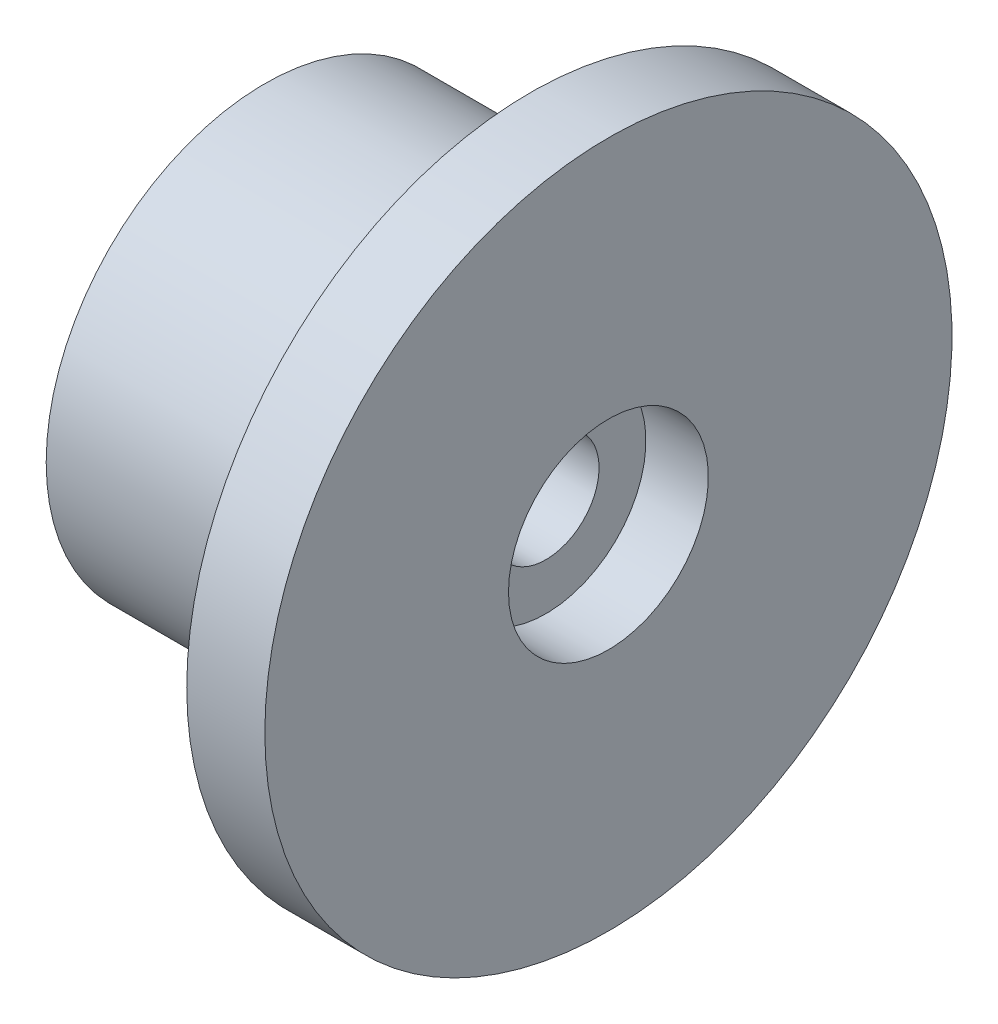
ISO-10303-21;
HEADER;
FILE_DESCRIPTION(('STEP AP214'),'2;1');
FILE_NAME('part.step','',(''),(''),'','','');
FILE_SCHEMA(('AUTOMOTIVE_DESIGN { 1 0 10303 214 1 1 1 1 }'));
ENDSEC;
DATA;
#1=APPLICATION_CONTEXT('core data for automotive mechanical design processes');
#2=APPLICATION_PROTOCOL_DEFINITION('international standard','automotive_design',2000,#1);
#3=PRODUCT_CONTEXT('',#1,'mechanical');
#4=PRODUCT('Part','Part','',(#3));
#5=PRODUCT_RELATED_PRODUCT_CATEGORY('part','',(#4));
#6=PRODUCT_DEFINITION_FORMATION('','',#4);
#7=PRODUCT_DEFINITION_CONTEXT('part definition',#1,'design');
#8=PRODUCT_DEFINITION('design','',#6,#7);
#9=PRODUCT_DEFINITION_SHAPE('','',#8);
#10=(LENGTH_UNIT() NAMED_UNIT(*) SI_UNIT(.MILLI.,.METRE.));
#11=(NAMED_UNIT(*) PLANE_ANGLE_UNIT() SI_UNIT($,.RADIAN.));
#12=(NAMED_UNIT(*) SI_UNIT($,.STERADIAN.) SOLID_ANGLE_UNIT());
#13=UNCERTAINTY_MEASURE_WITH_UNIT(LENGTH_MEASURE(1.E-05),#10,'distance_accuracy_value','');
#14=(GEOMETRIC_REPRESENTATION_CONTEXT(3) GLOBAL_UNCERTAINTY_ASSIGNED_CONTEXT((#13)) GLOBAL_UNIT_ASSIGNED_CONTEXT((#10,
#11,#12)) REPRESENTATION_CONTEXT('',''));
#15=CARTESIAN_POINT('',(0.,0.,0.));
#16=DIRECTION('',(0.,0.,1.));
#17=DIRECTION('',(1.,0.,0.));
#18=AXIS2_PLACEMENT_3D('',#15,#16,#17);
#19=CARTESIAN_POINT('',(-5.,0.,0.));
#20=DIRECTION('',(-1.,0.,0.));
#21=DIRECTION('',(0.,0.,1.));
#22=AXIS2_PLACEMENT_3D('',#19,#20,#21);
#23=CYLINDRICAL_SURFACE('',#22,1.7);
#24=CARTESIAN_POINT('',(8.99999999999999,0.,0.));
#25=DIRECTION('',(-1.,0.,0.));
#26=DIRECTION('',(0.,0.,1.));
#27=AXIS2_PLACEMENT_3D('',#24,#25,#26);
#28=CIRCLE('',#27,1.7);
#29=CARTESIAN_POINT('',(8.99999999999999,0.,1.7));
#30=VERTEX_POINT('',#29);
#31=EDGE_CURVE('E65',#30,#30,#28,.T.);
#32=ORIENTED_EDGE('',*,*,#31,.F.);
#33=EDGE_LOOP('',(#32));
#34=FACE_BOUND('',#33,.T.);
#35=CARTESIAN_POINT('',(0.,0.,0.));
#36=DIRECTION('',(-1.,0.,0.));
#37=DIRECTION('',(0.,0.,1.));
#38=AXIS2_PLACEMENT_3D('',#35,#36,#37);
#39=CIRCLE('',#38,1.7);
#40=CARTESIAN_POINT('',(0.,0.,1.7));
#41=VERTEX_POINT('',#40);
#42=EDGE_CURVE('E10',#41,#41,#39,.T.);
#43=ORIENTED_EDGE('',*,*,#42,.T.);
#44=EDGE_LOOP('',(#43));
#45=FACE_BOUND('',#44,.T.);
#46=ADVANCED_FACE('F40',(#34,#45),#23,.F.);
#47=CARTESIAN_POINT('',(0.,1.7,0.));
#48=DIRECTION('',(1.,0.,0.));
#49=DIRECTION('',(0.,0.,-1.));
#50=AXIS2_PLACEMENT_3D('',#47,#48,#49);
#51=PLANE('',#50);
#52=ORIENTED_EDGE('',*,*,#42,.F.);
#53=EDGE_LOOP('',(#52));
#54=FACE_BOUND('',#53,.T.);
#55=CARTESIAN_POINT('',(0.,0.,0.));
#56=DIRECTION('',(-1.,0.,0.));
#57=DIRECTION('',(0.,0.,1.));
#58=AXIS2_PLACEMENT_3D('',#55,#56,#57);
#59=CIRCLE('',#58,7.);
#60=CARTESIAN_POINT('',(0.,0.,7.));
#61=VERTEX_POINT('',#60);
#62=EDGE_CURVE('E43',#61,#61,#59,.T.);
#63=ORIENTED_EDGE('',*,*,#62,.T.);
#64=EDGE_LOOP('',(#63));
#65=FACE_BOUND('',#64,.T.);
#66=ADVANCED_FACE('F72',(#54,#65),#51,.F.);
#67=CARTESIAN_POINT('',(-5.,0.,0.));
#68=DIRECTION('',(-1.,0.,0.));
#69=DIRECTION('',(0.,0.,1.));
#70=AXIS2_PLACEMENT_3D('',#67,#68,#69);
#71=CYLINDRICAL_SURFACE('',#70,7.);
#72=ORIENTED_EDGE('',*,*,#62,.F.);
#73=EDGE_LOOP('',(#72));
#74=FACE_BOUND('',#73,.T.);
#75=CARTESIAN_POINT('',(8.5,0.,0.));
#76=DIRECTION('',(-1.,0.,0.));
#77=DIRECTION('',(0.,0.,1.));
#78=AXIS2_PLACEMENT_3D('',#75,#76,#77);
#79=CIRCLE('',#78,7.);
#80=CARTESIAN_POINT('',(8.5,0.,7.));
#81=VERTEX_POINT('',#80);
#82=EDGE_CURVE('E50',#81,#81,#79,.T.);
#83=ORIENTED_EDGE('',*,*,#82,.T.);
#84=EDGE_LOOP('',(#83));
#85=FACE_BOUND('',#84,.T.);
#86=ADVANCED_FACE('F78',(#74,#85),#71,.T.);
#87=CARTESIAN_POINT('',(8.5,7.,0.));
#88=DIRECTION('',(1.,0.,0.));
#89=DIRECTION('',(0.,0.,-1.));
#90=AXIS2_PLACEMENT_3D('',#87,#88,#89);
#91=PLANE('',#90);
#92=ORIENTED_EDGE('',*,*,#82,.F.);
#93=EDGE_LOOP('',(#92));
#94=FACE_BOUND('',#93,.T.);
#95=CARTESIAN_POINT('',(8.5,0.,0.));
#96=DIRECTION('',(-1.,0.,0.));
#97=DIRECTION('',(0.,0.,1.));
#98=AXIS2_PLACEMENT_3D('',#95,#96,#97);
#99=CIRCLE('',#98,11.);
#100=CARTESIAN_POINT('',(8.5,0.,11.));
#101=VERTEX_POINT('',#100);
#102=EDGE_CURVE('E51',#101,#101,#99,.T.);
#103=ORIENTED_EDGE('',*,*,#102,.T.);
#104=EDGE_LOOP('',(#103));
#105=FACE_BOUND('',#104,.T.);
#106=ADVANCED_FACE('F83',(#94,#105),#91,.F.);
#107=CARTESIAN_POINT('',(-5.,0.,0.));
#108=DIRECTION('',(-1.,0.,0.));
#109=DIRECTION('',(0.,0.,1.));
#110=AXIS2_PLACEMENT_3D('',#107,#108,#109);
#111=CYLINDRICAL_SURFACE('',#110,11.);
#112=ORIENTED_EDGE('',*,*,#102,.F.);
#113=EDGE_LOOP('',(#112));
#114=FACE_BOUND('',#113,.T.);
#115=CARTESIAN_POINT('',(11.,0.,0.));
#116=DIRECTION('',(-1.,0.,0.));
#117=DIRECTION('',(0.,0.,1.));
#118=AXIS2_PLACEMENT_3D('',#115,#116,#117);
#119=CIRCLE('',#118,11.);
#120=CARTESIAN_POINT('',(11.,0.,11.));
#121=VERTEX_POINT('',#120);
#122=EDGE_CURVE('E57',#121,#121,#119,.T.);
#123=ORIENTED_EDGE('',*,*,#122,.T.);
#124=EDGE_LOOP('',(#123));
#125=FACE_BOUND('',#124,.T.);
#126=ADVANCED_FACE('F90',(#114,#125),#111,.T.);
#127=CARTESIAN_POINT('',(11.,11.,0.));
#128=DIRECTION('',(-1.,0.,0.));
#129=DIRECTION('',(0.,0.,1.));
#130=AXIS2_PLACEMENT_3D('',#127,#128,#129);
#131=PLANE('',#130);
#132=ORIENTED_EDGE('',*,*,#122,.F.);
#133=EDGE_LOOP('',(#132));
#134=FACE_BOUND('',#133,.T.);
#135=CARTESIAN_POINT('',(11.,0.,0.));
#136=DIRECTION('',(-1.,0.,0.));
#137=DIRECTION('',(0.,0.,1.));
#138=AXIS2_PLACEMENT_3D('',#135,#136,#137);
#139=CIRCLE('',#138,3.2);
#140=CARTESIAN_POINT('',(11.,0.,3.2));
#141=VERTEX_POINT('',#140);
#142=EDGE_CURVE('E56',#141,#141,#139,.T.);
#143=ORIENTED_EDGE('',*,*,#142,.T.);
#144=EDGE_LOOP('',(#143));
#145=FACE_BOUND('',#144,.T.);
#146=ADVANCED_FACE('F91',(#134,#145),#131,.F.);
#147=CARTESIAN_POINT('',(-5.,0.,0.));
#148=DIRECTION('',(-1.,0.,0.));
#149=DIRECTION('',(0.,0.,1.));
#150=AXIS2_PLACEMENT_3D('',#147,#148,#149);
#151=CYLINDRICAL_SURFACE('',#150,3.2);
#152=ORIENTED_EDGE('',*,*,#142,.F.);
#153=EDGE_LOOP('',(#152));
#154=FACE_BOUND('',#153,.T.);
#155=CARTESIAN_POINT('',(8.99999999999999,0.,0.));
#156=DIRECTION('',(-1.,0.,0.));
#157=DIRECTION('',(0.,0.,1.));
#158=AXIS2_PLACEMENT_3D('',#155,#156,#157);
#159=CIRCLE('',#158,3.2);
#160=CARTESIAN_POINT('',(8.99999999999999,0.,3.2));
#161=VERTEX_POINT('',#160);
#162=EDGE_CURVE('E62',#161,#161,#159,.T.);
#163=ORIENTED_EDGE('',*,*,#162,.T.);
#164=EDGE_LOOP('',(#163));
#165=FACE_BOUND('',#164,.T.);
#166=ADVANCED_FACE('F94',(#154,#165),#151,.F.);
#167=CARTESIAN_POINT('',(9.,3.2,0.));
#168=DIRECTION('',(-1.,0.,0.));
#169=DIRECTION('',(0.,0.,1.));
#170=AXIS2_PLACEMENT_3D('',#167,#168,#169);
#171=PLANE('',#170);
#172=ORIENTED_EDGE('',*,*,#162,.F.);
#173=EDGE_LOOP('',(#172));
#174=FACE_BOUND('',#173,.T.);
#175=ORIENTED_EDGE('',*,*,#31,.T.);
#176=EDGE_LOOP('',(#175));
#177=FACE_BOUND('',#176,.T.);
#178=ADVANCED_FACE('F69',(#174,#177),#171,.F.);
#179=CLOSED_SHELL('',(#46,#66,#86,#106,#126,#146,#166,#178));
#180=MANIFOLD_SOLID_BREP('B2',#179);
#181=ADVANCED_BREP_SHAPE_REPRESENTATION('',(#18,#180),#14);
#182=SHAPE_DEFINITION_REPRESENTATION(#9,#181);
ENDSEC;
END-ISO-10303-21;
